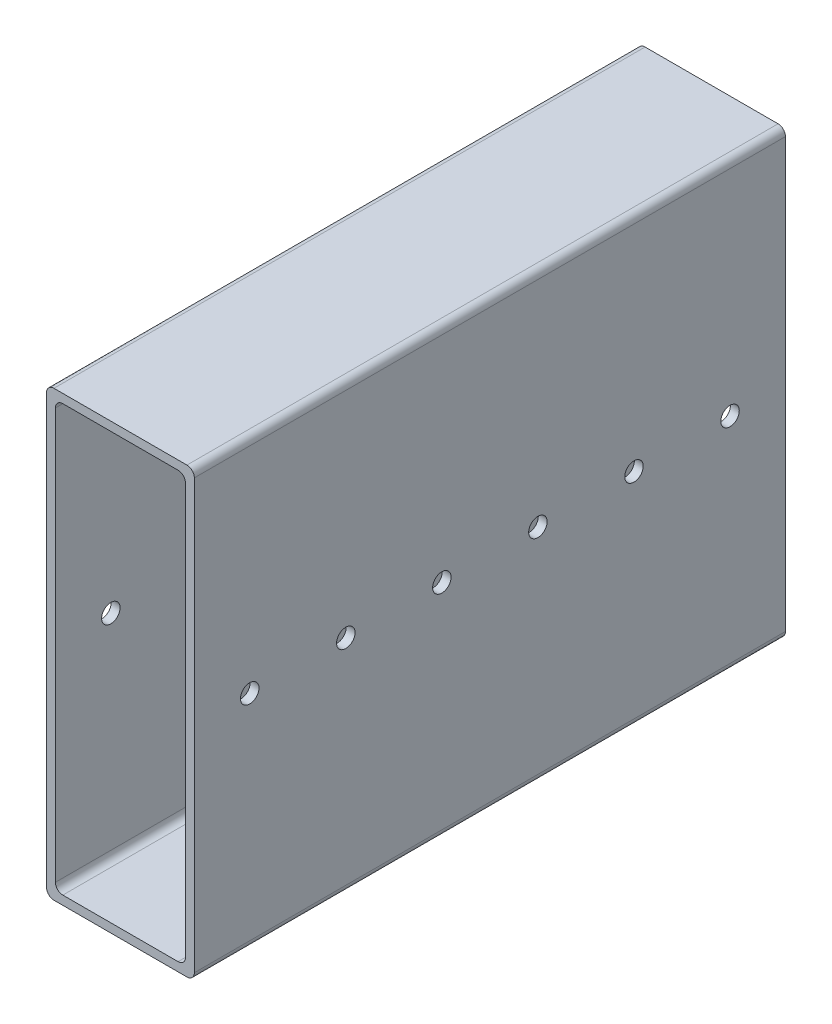
ISO-10303-21;
HEADER;
FILE_DESCRIPTION(('STEP AP214'),'2;1');
FILE_NAME('part.step','',(''),(''),'','','');
FILE_SCHEMA(('AUTOMOTIVE_DESIGN { 1 0 10303 214 1 1 1 1 }'));
ENDSEC;
DATA;
#1=APPLICATION_CONTEXT('core data for automotive mechanical design processes');
#2=APPLICATION_PROTOCOL_DEFINITION('international standard','automotive_design',2000,#1);
#3=PRODUCT_CONTEXT('',#1,'mechanical');
#4=PRODUCT('Part','Part','',(#3));
#5=PRODUCT_RELATED_PRODUCT_CATEGORY('part','',(#4));
#6=PRODUCT_DEFINITION_FORMATION('','',#4);
#7=PRODUCT_DEFINITION_CONTEXT('part definition',#1,'design');
#8=PRODUCT_DEFINITION('design','',#6,#7);
#9=PRODUCT_DEFINITION_SHAPE('','',#8);
#10=(LENGTH_UNIT() NAMED_UNIT(*) SI_UNIT(.MILLI.,.METRE.));
#11=(NAMED_UNIT(*) PLANE_ANGLE_UNIT() SI_UNIT($,.RADIAN.));
#12=(NAMED_UNIT(*) SI_UNIT($,.STERADIAN.) SOLID_ANGLE_UNIT());
#13=UNCERTAINTY_MEASURE_WITH_UNIT(LENGTH_MEASURE(1.E-05),#10,'distance_accuracy_value','');
#14=(GEOMETRIC_REPRESENTATION_CONTEXT(3) GLOBAL_UNCERTAINTY_ASSIGNED_CONTEXT((#13)) GLOBAL_UNIT_ASSIGNED_CONTEXT((#10,
#11,#12)) REPRESENTATION_CONTEXT('',''));
#15=CARTESIAN_POINT('',(0.,0.,0.));
#16=DIRECTION('',(0.,0.,1.));
#17=DIRECTION('',(1.,0.,0.));
#18=AXIS2_PLACEMENT_3D('',#15,#16,#17);
#19=CARTESIAN_POINT('',(34.4194414247179,-15.0508717369566,203.2));
#20=DIRECTION('',(0.,0.,-1.));
#21=DIRECTION('',(-1.,0.,0.));
#22=AXIS2_PLACEMENT_3D('',#19,#20,#21);
#23=CYLINDRICAL_SURFACE('',#22,2.54);
#24=CARTESIAN_POINT('',(34.4194414247179,-15.0508717369566,0.));
#25=DIRECTION('',(0.,0.,1.));
#26=DIRECTION('',(1.,0.,0.));
#27=AXIS2_PLACEMENT_3D('',#24,#25,#26);
#28=CIRCLE('',#27,2.54);
#29=CARTESIAN_POINT('',(34.4194414247179,-17.5908717369566,0.));
#30=VERTEX_POINT('',#29);
#31=CARTESIAN_POINT('',(36.9594414247179,-15.0508717369566,0.));
#32=VERTEX_POINT('',#31);
#33=EDGE_CURVE('E170',#30,#32,#28,.T.);
#34=ORIENTED_EDGE('',*,*,#33,.T.);
#35=DIRECTION('',(0.,0.,-1.));
#36=VECTOR('',#35,1.);
#37=CARTESIAN_POINT('',(36.9594414247179,-15.0508717369566,203.2));
#38=LINE('',#37,#36);
#39=CARTESIAN_POINT('',(36.9594414247179,-15.0508717369566,203.2));
#40=VERTEX_POINT('',#39);
#41=EDGE_CURVE('E151',#40,#32,#38,.T.);
#42=ORIENTED_EDGE('',*,*,#41,.F.);
#43=CARTESIAN_POINT('',(34.4194414247179,-15.0508717369566,203.2));
#44=DIRECTION('',(0.,0.,1.));
#45=DIRECTION('',(1.,0.,0.));
#46=AXIS2_PLACEMENT_3D('',#43,#44,#45);
#47=CIRCLE('',#46,2.54);
#48=CARTESIAN_POINT('',(34.4194414247179,-17.5908717369566,203.2));
#49=VERTEX_POINT('',#48);
#50=EDGE_CURVE('E158',#49,#40,#47,.T.);
#51=ORIENTED_EDGE('',*,*,#50,.F.);
#52=DIRECTION('',(0.,0.,-1.));
#53=VECTOR('',#52,1.);
#54=CARTESIAN_POINT('',(34.4194414247179,-17.5908717369566,203.2));
#55=LINE('',#54,#53);
#56=EDGE_CURVE('E309',#49,#30,#55,.T.);
#57=ORIENTED_EDGE('',*,*,#56,.T.);
#58=EDGE_LOOP('',(#34,#42,#51,#57));
#59=FACE_BOUND('',#58,.T.);
#60=ADVANCED_FACE('F32',(#59),#23,.T.);
#61=CARTESIAN_POINT('',(36.9594414247179,132.269128263043,203.2));
#62=DIRECTION('',(-1.,0.,0.));
#63=DIRECTION('',(0.,-1.,0.));
#64=AXIS2_PLACEMENT_3D('',#61,#62,#63);
#65=PLANE('',#64);
#66=CARTESIAN_POINT('',(36.9594414247179,58.6091282630434,184.15));
#67=DIRECTION('',(1.,0.,0.));
#68=DIRECTION('',(0.,1.,0.));
#69=AXIS2_PLACEMENT_3D('',#66,#67,#68);
#70=CIRCLE('',#69,3.175);
#71=CARTESIAN_POINT('',(36.9594414247179,61.7841282630434,184.15));
#72=VERTEX_POINT('',#71);
#73=EDGE_CURVE('E672',#72,#72,#70,.T.);
#74=ORIENTED_EDGE('',*,*,#73,.F.);
#75=EDGE_LOOP('',(#74));
#76=FACE_BOUND('',#75,.T.);
#77=CARTESIAN_POINT('',(36.9594414247179,58.6091282630434,19.05));
#78=DIRECTION('',(1.,0.,0.));
#79=DIRECTION('',(0.,1.,0.));
#80=AXIS2_PLACEMENT_3D('',#77,#78,#79);
#81=CIRCLE('',#80,3.175);
#82=CARTESIAN_POINT('',(36.9594414247179,61.7841282630434,19.05));
#83=VERTEX_POINT('',#82);
#84=EDGE_CURVE('E230',#83,#83,#81,.T.);
#85=ORIENTED_EDGE('',*,*,#84,.F.);
#86=EDGE_LOOP('',(#85));
#87=FACE_BOUND('',#86,.T.);
#88=CARTESIAN_POINT('',(36.9594414247179,58.6091282630434,151.13));
#89=DIRECTION('',(1.,0.,0.));
#90=DIRECTION('',(0.,1.,0.));
#91=AXIS2_PLACEMENT_3D('',#88,#89,#90);
#92=CIRCLE('',#91,3.175);
#93=CARTESIAN_POINT('',(36.9594414247179,61.7841282630434,151.13));
#94=VERTEX_POINT('',#93);
#95=EDGE_CURVE('E226',#94,#94,#92,.T.);
#96=ORIENTED_EDGE('',*,*,#95,.F.);
#97=EDGE_LOOP('',(#96));
#98=FACE_BOUND('',#97,.T.);
#99=CARTESIAN_POINT('',(36.9594414247179,58.6091282630434,118.11));
#100=DIRECTION('',(1.,0.,0.));
#101=DIRECTION('',(0.,1.,0.));
#102=AXIS2_PLACEMENT_3D('',#99,#100,#101);
#103=CIRCLE('',#102,3.175);
#104=CARTESIAN_POINT('',(36.9594414247179,61.7841282630434,118.11));
#105=VERTEX_POINT('',#104);
#106=EDGE_CURVE('E222',#105,#105,#103,.T.);
#107=ORIENTED_EDGE('',*,*,#106,.F.);
#108=EDGE_LOOP('',(#107));
#109=FACE_BOUND('',#108,.T.);
#110=CARTESIAN_POINT('',(36.9594414247179,58.6091282630434,85.09));
#111=DIRECTION('',(1.,0.,0.));
#112=DIRECTION('',(0.,1.,0.));
#113=AXIS2_PLACEMENT_3D('',#110,#111,#112);
#114=CIRCLE('',#113,3.175);
#115=CARTESIAN_POINT('',(36.9594414247179,61.7841282630434,85.09));
#116=VERTEX_POINT('',#115);
#117=EDGE_CURVE('E217',#116,#116,#114,.T.);
#118=ORIENTED_EDGE('',*,*,#117,.F.);
#119=EDGE_LOOP('',(#118));
#120=FACE_BOUND('',#119,.T.);
#121=CARTESIAN_POINT('',(36.9594414247179,58.6091282630434,52.07));
#122=DIRECTION('',(1.,0.,0.));
#123=DIRECTION('',(0.,1.,0.));
#124=AXIS2_PLACEMENT_3D('',#121,#122,#123);
#125=CIRCLE('',#124,3.17500000000001);
#126=CARTESIAN_POINT('',(36.9594414247179,61.7841282630434,52.07));
#127=VERTEX_POINT('',#126);
#128=EDGE_CURVE('E212',#127,#127,#125,.T.);
#129=ORIENTED_EDGE('',*,*,#128,.F.);
#130=EDGE_LOOP('',(#129));
#131=FACE_BOUND('',#130,.T.);
#132=DIRECTION('',(0.,1.,0.));
#133=VECTOR('',#132,1.);
#134=CARTESIAN_POINT('',(36.9594414247179,132.269128263043,0.));
#135=LINE('',#134,#133);
#136=CARTESIAN_POINT('',(36.9594414247179,132.269128263043,0.));
#137=VERTEX_POINT('',#136);
#138=EDGE_CURVE('E311',#32,#137,#135,.T.);
#139=ORIENTED_EDGE('',*,*,#138,.T.);
#140=DIRECTION('',(0.,0.,-1.));
#141=VECTOR('',#140,1.);
#142=CARTESIAN_POINT('',(36.9594414247179,132.269128263043,203.2));
#143=LINE('',#142,#141);
#144=CARTESIAN_POINT('',(36.9594414247179,132.269128263043,203.2));
#145=VERTEX_POINT('',#144);
#146=EDGE_CURVE('E154',#145,#137,#143,.T.);
#147=ORIENTED_EDGE('',*,*,#146,.F.);
#148=DIRECTION('',(0.,1.,0.));
#149=VECTOR('',#148,1.);
#150=CARTESIAN_POINT('',(36.9594414247179,132.269128263043,203.2));
#151=LINE('',#150,#149);
#152=EDGE_CURVE('E147',#40,#145,#151,.T.);
#153=ORIENTED_EDGE('',*,*,#152,.F.);
#154=ORIENTED_EDGE('',*,*,#41,.T.);
#155=EDGE_LOOP('',(#139,#147,#153,#154));
#156=FACE_BOUND('',#155,.T.);
#157=ADVANCED_FACE('F149',(#76,#87,#98,#109,#120,#131,#156),#65,.F.);
#158=CARTESIAN_POINT('',(34.4194414247179,132.269128263043,203.2));
#159=DIRECTION('',(0.,0.,-1.));
#160=DIRECTION('',(-1.,0.,0.));
#161=AXIS2_PLACEMENT_3D('',#158,#159,#160);
#162=CYLINDRICAL_SURFACE('',#161,2.53999999999999);
#163=CARTESIAN_POINT('',(34.4194414247179,132.269128263043,0.));
#164=DIRECTION('',(0.,0.,1.));
#165=DIRECTION('',(1.,0.,0.));
#166=AXIS2_PLACEMENT_3D('',#163,#164,#165);
#167=CIRCLE('',#166,2.53999999999999);
#168=CARTESIAN_POINT('',(34.4194414247179,134.809128263043,0.));
#169=VERTEX_POINT('',#168);
#170=EDGE_CURVE('E313',#137,#169,#167,.T.);
#171=ORIENTED_EDGE('',*,*,#170,.T.);
#172=DIRECTION('',(0.,0.,-1.));
#173=VECTOR('',#172,1.);
#174=CARTESIAN_POINT('',(34.4194414247179,134.809128263043,203.2));
#175=LINE('',#174,#173);
#176=CARTESIAN_POINT('',(34.4194414247179,134.809128263043,203.2));
#177=VERTEX_POINT('',#176);
#178=EDGE_CURVE('E175',#177,#169,#175,.T.);
#179=ORIENTED_EDGE('',*,*,#178,.F.);
#180=CARTESIAN_POINT('',(34.4194414247179,132.269128263043,203.2));
#181=DIRECTION('',(0.,0.,1.));
#182=DIRECTION('',(1.,0.,0.));
#183=AXIS2_PLACEMENT_3D('',#180,#181,#182);
#184=CIRCLE('',#183,2.53999999999999);
#185=EDGE_CURVE('E157',#145,#177,#184,.T.);
#186=ORIENTED_EDGE('',*,*,#185,.F.);
#187=ORIENTED_EDGE('',*,*,#146,.T.);
#188=EDGE_LOOP('',(#171,#179,#186,#187));
#189=FACE_BOUND('',#188,.T.);
#190=ADVANCED_FACE('F360',(#189),#162,.T.);
#191=CARTESIAN_POINT('',(-11.3005585752821,134.809128263043,203.2));
#192=DIRECTION('',(0.,-1.,0.));
#193=DIRECTION('',(0.,0.,-1.));
#194=AXIS2_PLACEMENT_3D('',#191,#192,#193);
#195=PLANE('',#194);
#196=DIRECTION('',(-1.,0.,0.));
#197=VECTOR('',#196,1.);
#198=CARTESIAN_POINT('',(-11.3005585752821,134.809128263043,0.));
#199=LINE('',#198,#197);
#200=CARTESIAN_POINT('',(-11.3005585752821,134.809128263043,0.));
#201=VERTEX_POINT('',#200);
#202=EDGE_CURVE('E315',#169,#201,#199,.T.);
#203=ORIENTED_EDGE('',*,*,#202,.T.);
#204=DIRECTION('',(0.,0.,-1.));
#205=VECTOR('',#204,1.);
#206=CARTESIAN_POINT('',(-11.3005585752821,134.809128263043,203.2));
#207=LINE('',#206,#205);
#208=CARTESIAN_POINT('',(-11.3005585752821,134.809128263043,203.2));
#209=VERTEX_POINT('',#208);
#210=EDGE_CURVE('E334',#209,#201,#207,.T.);
#211=ORIENTED_EDGE('',*,*,#210,.F.);
#212=DIRECTION('',(-1.,0.,0.));
#213=VECTOR('',#212,1.);
#214=CARTESIAN_POINT('',(-11.3005585752821,134.809128263043,203.2));
#215=LINE('',#214,#213);
#216=EDGE_CURVE('E300',#177,#209,#215,.T.);
#217=ORIENTED_EDGE('',*,*,#216,.F.);
#218=ORIENTED_EDGE('',*,*,#178,.T.);
#219=EDGE_LOOP('',(#203,#211,#217,#218));
#220=FACE_BOUND('',#219,.T.);
#221=ADVANCED_FACE('F341',(#220),#195,.F.);
#222=CARTESIAN_POINT('',(-11.3005585752821,132.269128263043,203.2));
#223=DIRECTION('',(0.,0.,-1.));
#224=DIRECTION('',(-1.,0.,0.));
#225=AXIS2_PLACEMENT_3D('',#222,#223,#224);
#226=CYLINDRICAL_SURFACE('',#225,2.53999999999999);
#227=CARTESIAN_POINT('',(-11.3005585752821,132.269128263043,0.));
#228=DIRECTION('',(0.,0.,1.));
#229=DIRECTION('',(-1.,0.,0.));
#230=AXIS2_PLACEMENT_3D('',#227,#228,#229);
#231=CIRCLE('',#230,2.53999999999999);
#232=CARTESIAN_POINT('',(-13.8405585752821,132.269128263043,0.));
#233=VERTEX_POINT('',#232);
#234=EDGE_CURVE('E317',#201,#233,#231,.T.);
#235=ORIENTED_EDGE('',*,*,#234,.T.);
#236=DIRECTION('',(0.,0.,-1.));
#237=VECTOR('',#236,1.);
#238=CARTESIAN_POINT('',(-13.8405585752821,132.269128263043,203.2));
#239=LINE('',#238,#237);
#240=CARTESIAN_POINT('',(-13.8405585752821,132.269128263043,203.2));
#241=VERTEX_POINT('',#240);
#242=EDGE_CURVE('E331',#241,#233,#239,.T.);
#243=ORIENTED_EDGE('',*,*,#242,.F.);
#244=CARTESIAN_POINT('',(-11.3005585752821,132.269128263043,203.2));
#245=DIRECTION('',(0.,0.,1.));
#246=DIRECTION('',(-1.,0.,0.));
#247=AXIS2_PLACEMENT_3D('',#244,#245,#246);
#248=CIRCLE('',#247,2.53999999999999);
#249=EDGE_CURVE('E302',#209,#241,#248,.T.);
#250=ORIENTED_EDGE('',*,*,#249,.F.);
#251=ORIENTED_EDGE('',*,*,#210,.T.);
#252=EDGE_LOOP('',(#235,#243,#250,#251));
#253=FACE_BOUND('',#252,.T.);
#254=ADVANCED_FACE('F352',(#253),#226,.T.);
#255=CARTESIAN_POINT('',(-13.8405585752821,132.269128263043,203.2));
#256=DIRECTION('',(1.,0.,0.));
#257=DIRECTION('',(0.,1.,0.));
#258=AXIS2_PLACEMENT_3D('',#255,#256,#257);
#259=PLANE('',#258);
#260=CARTESIAN_POINT('',(-13.8405585752821,58.6091282630434,184.15));
#261=DIRECTION('',(1.,0.,0.));
#262=DIRECTION('',(0.,1.,0.));
#263=AXIS2_PLACEMENT_3D('',#260,#261,#262);
#264=CIRCLE('',#263,3.175);
#265=CARTESIAN_POINT('',(-13.8405585752821,61.7841282630434,184.15));
#266=VERTEX_POINT('',#265);
#267=EDGE_CURVE('E237',#266,#266,#264,.T.);
#268=ORIENTED_EDGE('',*,*,#267,.T.);
#269=EDGE_LOOP('',(#268));
#270=FACE_BOUND('',#269,.T.);
#271=CARTESIAN_POINT('',(-13.8405585752821,58.6091282630434,19.05));
#272=DIRECTION('',(1.,0.,0.));
#273=DIRECTION('',(0.,1.,0.));
#274=AXIS2_PLACEMENT_3D('',#271,#272,#273);
#275=CIRCLE('',#274,3.175);
#276=CARTESIAN_POINT('',(-13.8405585752821,61.7841282630434,19.05));
#277=VERTEX_POINT('',#276);
#278=EDGE_CURVE('E234',#277,#277,#275,.T.);
#279=ORIENTED_EDGE('',*,*,#278,.T.);
#280=EDGE_LOOP('',(#279));
#281=FACE_BOUND('',#280,.T.);
#282=CARTESIAN_POINT('',(-13.8405585752821,58.6091282630434,151.13));
#283=DIRECTION('',(1.,0.,0.));
#284=DIRECTION('',(0.,1.,0.));
#285=AXIS2_PLACEMENT_3D('',#282,#283,#284);
#286=CIRCLE('',#285,3.175);
#287=CARTESIAN_POINT('',(-13.8405585752821,61.7841282630434,151.13));
#288=VERTEX_POINT('',#287);
#289=EDGE_CURVE('E252',#288,#288,#286,.T.);
#290=ORIENTED_EDGE('',*,*,#289,.T.);
#291=EDGE_LOOP('',(#290));
#292=FACE_BOUND('',#291,.T.);
#293=CARTESIAN_POINT('',(-13.8405585752821,58.6091282630434,118.11));
#294=DIRECTION('',(1.,0.,0.));
#295=DIRECTION('',(0.,1.,0.));
#296=AXIS2_PLACEMENT_3D('',#293,#294,#295);
#297=CIRCLE('',#296,3.175);
#298=CARTESIAN_POINT('',(-13.8405585752821,61.7841282630434,118.11));
#299=VERTEX_POINT('',#298);
#300=EDGE_CURVE('E259',#299,#299,#297,.T.);
#301=ORIENTED_EDGE('',*,*,#300,.T.);
#302=EDGE_LOOP('',(#301));
#303=FACE_BOUND('',#302,.T.);
#304=CARTESIAN_POINT('',(-13.8405585752821,58.6091282630434,85.09));
#305=DIRECTION('',(1.,0.,0.));
#306=DIRECTION('',(0.,1.,0.));
#307=AXIS2_PLACEMENT_3D('',#304,#305,#306);
#308=CIRCLE('',#307,3.175);
#309=CARTESIAN_POINT('',(-13.8405585752821,61.7841282630434,85.09));
#310=VERTEX_POINT('',#309);
#311=EDGE_CURVE('E266',#310,#310,#308,.T.);
#312=ORIENTED_EDGE('',*,*,#311,.T.);
#313=EDGE_LOOP('',(#312));
#314=FACE_BOUND('',#313,.T.);
#315=CARTESIAN_POINT('',(-13.8405585752821,58.6091282630434,52.07));
#316=DIRECTION('',(1.,0.,0.));
#317=DIRECTION('',(0.,1.,0.));
#318=AXIS2_PLACEMENT_3D('',#315,#316,#317);
#319=CIRCLE('',#318,3.17500000000001);
#320=CARTESIAN_POINT('',(-13.8405585752821,61.7841282630434,52.07));
#321=VERTEX_POINT('',#320);
#322=EDGE_CURVE('E273',#321,#321,#319,.T.);
#323=ORIENTED_EDGE('',*,*,#322,.T.);
#324=EDGE_LOOP('',(#323));
#325=FACE_BOUND('',#324,.T.);
#326=DIRECTION('',(0.,-1.,0.));
#327=VECTOR('',#326,1.);
#328=CARTESIAN_POINT('',(-13.8405585752821,132.269128263043,0.));
#329=LINE('',#328,#327);
#330=CARTESIAN_POINT('',(-13.8405585752821,-15.0508717369566,0.));
#331=VERTEX_POINT('',#330);
#332=EDGE_CURVE('E319',#233,#331,#329,.T.);
#333=ORIENTED_EDGE('',*,*,#332,.T.);
#334=DIRECTION('',(0.,0.,-1.));
#335=VECTOR('',#334,1.);
#336=CARTESIAN_POINT('',(-13.8405585752821,-15.0508717369566,203.2));
#337=LINE('',#336,#335);
#338=CARTESIAN_POINT('',(-13.8405585752821,-15.0508717369566,203.2));
#339=VERTEX_POINT('',#338);
#340=EDGE_CURVE('E328',#339,#331,#337,.T.);
#341=ORIENTED_EDGE('',*,*,#340,.F.);
#342=DIRECTION('',(0.,-1.,0.));
#343=VECTOR('',#342,1.);
#344=CARTESIAN_POINT('',(-13.8405585752821,132.269128263043,203.2));
#345=LINE('',#344,#343);
#346=EDGE_CURVE('E304',#241,#339,#345,.T.);
#347=ORIENTED_EDGE('',*,*,#346,.F.);
#348=ORIENTED_EDGE('',*,*,#242,.T.);
#349=EDGE_LOOP('',(#333,#341,#347,#348));
#350=FACE_BOUND('',#349,.T.);
#351=ADVANCED_FACE('F356',(#270,#281,#292,#303,#314,#325,#350),#259,.F.);
#352=CARTESIAN_POINT('',(-11.3005585752821,-15.0508717369566,203.2));
#353=DIRECTION('',(0.,0.,-1.));
#354=DIRECTION('',(-1.,0.,0.));
#355=AXIS2_PLACEMENT_3D('',#352,#353,#354);
#356=CYLINDRICAL_SURFACE('',#355,2.54);
#357=CARTESIAN_POINT('',(-11.3005585752821,-15.0508717369566,0.));
#358=DIRECTION('',(0.,0.,1.));
#359=DIRECTION('',(-1.,0.,0.));
#360=AXIS2_PLACEMENT_3D('',#357,#358,#359);
#361=CIRCLE('',#360,2.54);
#362=CARTESIAN_POINT('',(-11.3005585752821,-17.5908717369566,0.));
#363=VERTEX_POINT('',#362);
#364=EDGE_CURVE('E321',#331,#363,#361,.T.);
#365=ORIENTED_EDGE('',*,*,#364,.T.);
#366=DIRECTION('',(0.,0.,-1.));
#367=VECTOR('',#366,1.);
#368=CARTESIAN_POINT('',(-11.3005585752821,-17.5908717369566,203.2));
#369=LINE('',#368,#367);
#370=CARTESIAN_POINT('',(-11.3005585752821,-17.5908717369566,203.2));
#371=VERTEX_POINT('',#370);
#372=EDGE_CURVE('E325',#371,#363,#369,.T.);
#373=ORIENTED_EDGE('',*,*,#372,.F.);
#374=CARTESIAN_POINT('',(-11.3005585752821,-15.0508717369566,203.2));
#375=DIRECTION('',(0.,0.,1.));
#376=DIRECTION('',(-1.,0.,0.));
#377=AXIS2_PLACEMENT_3D('',#374,#375,#376);
#378=CIRCLE('',#377,2.54);
#379=EDGE_CURVE('E306',#339,#371,#378,.T.);
#380=ORIENTED_EDGE('',*,*,#379,.F.);
#381=ORIENTED_EDGE('',*,*,#340,.T.);
#382=EDGE_LOOP('',(#365,#373,#380,#381));
#383=FACE_BOUND('',#382,.T.);
#384=ADVANCED_FACE('F427',(#383),#356,.T.);
#385=CARTESIAN_POINT('',(-11.3005585752821,-17.5908717369566,203.2));
#386=DIRECTION('',(0.,1.,0.));
#387=DIRECTION('',(0.,0.,1.));
#388=AXIS2_PLACEMENT_3D('',#385,#386,#387);
#389=PLANE('',#388);
#390=DIRECTION('',(1.,0.,0.));
#391=VECTOR('',#390,1.);
#392=CARTESIAN_POINT('',(-11.3005585752821,-17.5908717369566,0.));
#393=LINE('',#392,#391);
#394=EDGE_CURVE('E167',#363,#30,#393,.T.);
#395=ORIENTED_EDGE('',*,*,#394,.T.);
#396=ORIENTED_EDGE('',*,*,#56,.F.);
#397=DIRECTION('',(1.,0.,0.));
#398=VECTOR('',#397,1.);
#399=CARTESIAN_POINT('',(-11.3005585752821,-17.5908717369566,203.2));
#400=LINE('',#399,#398);
#401=EDGE_CURVE('E163',#371,#49,#400,.T.);
#402=ORIENTED_EDGE('',*,*,#401,.F.);
#403=ORIENTED_EDGE('',*,*,#372,.T.);
#404=EDGE_LOOP('',(#395,#396,#402,#403));
#405=FACE_BOUND('',#404,.T.);
#406=ADVANCED_FACE('F421',(#405),#389,.F.);
#407=CARTESIAN_POINT('',(34.4194414247179,-15.0508717369566,203.2));
#408=DIRECTION('',(0.,0.,1.));
#409=DIRECTION('',(1.,0.,0.));
#410=AXIS2_PLACEMENT_3D('',#407,#408,#409);
#411=PLANE('',#410);
#412=DIRECTION('',(1.,0.,0.));
#413=VECTOR('',#412,1.);
#414=CARTESIAN_POINT('',(-11.3005585752821,-14.5428717369566,203.2));
#415=LINE('',#414,#413);
#416=CARTESIAN_POINT('',(-8.2525585752821,-14.5428717369566,203.2));
#417=VERTEX_POINT('',#416);
#418=CARTESIAN_POINT('',(31.3714414247179,-14.5428717369566,203.2));
#419=VERTEX_POINT('',#418);
#420=EDGE_CURVE('E296',#417,#419,#415,.T.);
#421=ORIENTED_EDGE('',*,*,#420,.F.);
#422=CARTESIAN_POINT('',(-8.2525585752821,-12.0028717369566,203.2));
#423=DIRECTION('',(0.,0.,1.));
#424=DIRECTION('',(1.,0.,0.));
#425=AXIS2_PLACEMENT_3D('',#422,#423,#424);
#426=CIRCLE('',#425,2.54);
#427=CARTESIAN_POINT('',(-10.7925585752821,-12.0028717369566,203.2));
#428=VERTEX_POINT('',#427);
#429=EDGE_CURVE('E201',#417,#428,#426,.F.);
#430=ORIENTED_EDGE('',*,*,#429,.T.);
#431=DIRECTION('',(0.,-1.,0.));
#432=VECTOR('',#431,1.);
#433=CARTESIAN_POINT('',(-10.7925585752821,132.269128263043,203.2));
#434=LINE('',#433,#432);
#435=CARTESIAN_POINT('',(-10.7925585752821,129.221128263043,203.2));
#436=VERTEX_POINT('',#435);
#437=EDGE_CURVE('E293',#436,#428,#434,.T.);
#438=ORIENTED_EDGE('',*,*,#437,.F.);
#439=CARTESIAN_POINT('',(-8.25255857528212,129.221128263043,203.2));
#440=DIRECTION('',(0.,0.,1.));
#441=DIRECTION('',(1.,0.,0.));
#442=AXIS2_PLACEMENT_3D('',#439,#440,#441);
#443=CIRCLE('',#442,2.54);
#444=CARTESIAN_POINT('',(-8.25255857528212,131.761128263043,203.2));
#445=VERTEX_POINT('',#444);
#446=EDGE_CURVE('E11',#436,#445,#443,.F.);
#447=ORIENTED_EDGE('',*,*,#446,.T.);
#448=DIRECTION('',(-1.,0.,0.));
#449=VECTOR('',#448,1.);
#450=CARTESIAN_POINT('',(-11.3005585752821,131.761128263043,203.2));
#451=LINE('',#450,#449);
#452=CARTESIAN_POINT('',(31.3714414247179,131.761128263043,203.2));
#453=VERTEX_POINT('',#452);
#454=EDGE_CURVE('E291',#453,#445,#451,.T.);
#455=ORIENTED_EDGE('',*,*,#454,.F.);
#456=CARTESIAN_POINT('',(31.3714414247179,129.221128263043,203.2));
#457=DIRECTION('',(0.,0.,1.));
#458=DIRECTION('',(1.,0.,0.));
#459=AXIS2_PLACEMENT_3D('',#456,#457,#458);
#460=CIRCLE('',#459,2.54);
#461=CARTESIAN_POINT('',(33.9114414247179,129.221128263043,203.2));
#462=VERTEX_POINT('',#461);
#463=EDGE_CURVE('E205',#453,#462,#460,.F.);
#464=ORIENTED_EDGE('',*,*,#463,.T.);
#465=DIRECTION('',(0.,1.,0.));
#466=VECTOR('',#465,1.);
#467=CARTESIAN_POINT('',(33.9114414247179,132.269128263043,203.2));
#468=LINE('',#467,#466);
#469=CARTESIAN_POINT('',(33.9114414247179,-12.0028717369566,203.2));
#470=VERTEX_POINT('',#469);
#471=EDGE_CURVE('E283',#470,#462,#468,.T.);
#472=ORIENTED_EDGE('',*,*,#471,.F.);
#473=CARTESIAN_POINT('',(31.3714414247179,-12.0028717369566,203.2));
#474=DIRECTION('',(0.,0.,1.));
#475=DIRECTION('',(1.,0.,0.));
#476=AXIS2_PLACEMENT_3D('',#473,#474,#475);
#477=CIRCLE('',#476,2.54);
#478=EDGE_CURVE('E197',#470,#419,#477,.F.);
#479=ORIENTED_EDGE('',*,*,#478,.T.);
#480=EDGE_LOOP('',(#421,#430,#438,#447,#455,#464,#472,#479));
#481=FACE_BOUND('',#480,.T.);
#482=ORIENTED_EDGE('',*,*,#50,.T.);
#483=ORIENTED_EDGE('',*,*,#152,.T.);
#484=ORIENTED_EDGE('',*,*,#185,.T.);
#485=ORIENTED_EDGE('',*,*,#216,.T.);
#486=ORIENTED_EDGE('',*,*,#249,.T.);
#487=ORIENTED_EDGE('',*,*,#346,.T.);
#488=ORIENTED_EDGE('',*,*,#379,.T.);
#489=ORIENTED_EDGE('',*,*,#401,.T.);
#490=EDGE_LOOP('',(#482,#483,#484,#485,#486,#487,#488,#489));
#491=FACE_BOUND('',#490,.T.);
#492=ADVANCED_FACE('F161',(#481,#491),#411,.T.);
#493=CARTESIAN_POINT('',(34.4194414247179,-15.0508717369566,0.));
#494=DIRECTION('',(0.,0.,1.));
#495=DIRECTION('',(1.,0.,0.));
#496=AXIS2_PLACEMENT_3D('',#493,#494,#495);
#497=PLANE('',#496);
#498=DIRECTION('',(0.,-1.,0.));
#499=VECTOR('',#498,1.);
#500=CARTESIAN_POINT('',(-10.7925585752821,132.269128263043,0.));
#501=LINE('',#500,#499);
#502=CARTESIAN_POINT('',(-10.7925585752821,129.221128263043,0.));
#503=VERTEX_POINT('',#502);
#504=CARTESIAN_POINT('',(-10.7925585752821,-12.0028717369566,0.));
#505=VERTEX_POINT('',#504);
#506=EDGE_CURVE('E284',#503,#505,#501,.T.);
#507=ORIENTED_EDGE('',*,*,#506,.T.);
#508=CARTESIAN_POINT('',(-8.2525585752821,-12.0028717369566,0.));
#509=DIRECTION('',(0.,0.,1.));
#510=DIRECTION('',(1.,0.,0.));
#511=AXIS2_PLACEMENT_3D('',#508,#509,#510);
#512=CIRCLE('',#511,2.54);
#513=CARTESIAN_POINT('',(-8.2525585752821,-14.5428717369566,0.));
#514=VERTEX_POINT('',#513);
#515=EDGE_CURVE('E199',#505,#514,#512,.T.);
#516=ORIENTED_EDGE('',*,*,#515,.T.);
#517=DIRECTION('',(1.,0.,0.));
#518=VECTOR('',#517,1.);
#519=CARTESIAN_POINT('',(-11.3005585752821,-14.5428717369566,0.));
#520=LINE('',#519,#518);
#521=CARTESIAN_POINT('',(31.3714414247179,-14.5428717369566,0.));
#522=VERTEX_POINT('',#521);
#523=EDGE_CURVE('E280',#514,#522,#520,.T.);
#524=ORIENTED_EDGE('',*,*,#523,.T.);
#525=CARTESIAN_POINT('',(31.3714414247179,-12.0028717369566,0.));
#526=DIRECTION('',(0.,0.,1.));
#527=DIRECTION('',(1.,0.,0.));
#528=AXIS2_PLACEMENT_3D('',#525,#526,#527);
#529=CIRCLE('',#528,2.54);
#530=CARTESIAN_POINT('',(33.9114414247179,-12.0028717369566,0.));
#531=VERTEX_POINT('',#530);
#532=EDGE_CURVE('E195',#522,#531,#529,.T.);
#533=ORIENTED_EDGE('',*,*,#532,.T.);
#534=DIRECTION('',(0.,1.,0.));
#535=VECTOR('',#534,1.);
#536=CARTESIAN_POINT('',(33.9114414247179,132.269128263043,0.));
#537=LINE('',#536,#535);
#538=CARTESIAN_POINT('',(33.9114414247179,129.221128263043,0.));
#539=VERTEX_POINT('',#538);
#540=EDGE_CURVE('E276',#531,#539,#537,.T.);
#541=ORIENTED_EDGE('',*,*,#540,.T.);
#542=CARTESIAN_POINT('',(31.3714414247179,129.221128263043,0.));
#543=DIRECTION('',(0.,0.,1.));
#544=DIRECTION('',(1.,0.,0.));
#545=AXIS2_PLACEMENT_3D('',#542,#543,#544);
#546=CIRCLE('',#545,2.54);
#547=CARTESIAN_POINT('',(31.3714414247179,131.761128263043,0.));
#548=VERTEX_POINT('',#547);
#549=EDGE_CURVE('E203',#539,#548,#546,.T.);
#550=ORIENTED_EDGE('',*,*,#549,.T.);
#551=DIRECTION('',(-1.,0.,0.));
#552=VECTOR('',#551,1.);
#553=CARTESIAN_POINT('',(-11.3005585752821,131.761128263043,0.));
#554=LINE('',#553,#552);
#555=CARTESIAN_POINT('',(-8.25255857528212,131.761128263043,0.));
#556=VERTEX_POINT('',#555);
#557=EDGE_CURVE('E279',#548,#556,#554,.T.);
#558=ORIENTED_EDGE('',*,*,#557,.T.);
#559=CARTESIAN_POINT('',(-8.25255857528212,129.221128263043,0.));
#560=DIRECTION('',(0.,0.,1.));
#561=DIRECTION('',(1.,0.,0.));
#562=AXIS2_PLACEMENT_3D('',#559,#560,#561);
#563=CIRCLE('',#562,2.54);
#564=EDGE_CURVE('E41',#556,#503,#563,.T.);
#565=ORIENTED_EDGE('',*,*,#564,.T.);
#566=EDGE_LOOP('',(#507,#516,#524,#533,#541,#550,#558,#565));
#567=FACE_BOUND('',#566,.T.);
#568=ORIENTED_EDGE('',*,*,#33,.F.);
#569=ORIENTED_EDGE('',*,*,#394,.F.);
#570=ORIENTED_EDGE('',*,*,#364,.F.);
#571=ORIENTED_EDGE('',*,*,#332,.F.);
#572=ORIENTED_EDGE('',*,*,#234,.F.);
#573=ORIENTED_EDGE('',*,*,#202,.F.);
#574=ORIENTED_EDGE('',*,*,#170,.F.);
#575=ORIENTED_EDGE('',*,*,#138,.F.);
#576=EDGE_LOOP('',(#568,#569,#570,#571,#572,#573,#574,#575));
#577=FACE_BOUND('',#576,.T.);
#578=ADVANCED_FACE('F347',(#567,#577),#497,.F.);
#579=CARTESIAN_POINT('',(33.9114414247179,132.269128263043,203.2));
#580=DIRECTION('',(-1.,0.,0.));
#581=DIRECTION('',(0.,-1.,0.));
#582=AXIS2_PLACEMENT_3D('',#579,#580,#581);
#583=PLANE('',#582);
#584=CARTESIAN_POINT('',(33.9114414247179,58.6091282630434,184.15));
#585=DIRECTION('',(-1.,0.,0.));
#586=DIRECTION('',(0.,-1.,0.));
#587=AXIS2_PLACEMENT_3D('',#584,#585,#586);
#588=CIRCLE('',#587,3.175);
#589=CARTESIAN_POINT('',(33.9114414247179,55.4341282630434,184.15));
#590=VERTEX_POINT('',#589);
#591=EDGE_CURVE('E242',#590,#590,#588,.T.);
#592=ORIENTED_EDGE('',*,*,#591,.F.);
#593=EDGE_LOOP('',(#592));
#594=FACE_BOUND('',#593,.T.);
#595=CARTESIAN_POINT('',(33.9114414247179,58.6091282630434,19.05));
#596=DIRECTION('',(-1.,0.,0.));
#597=DIRECTION('',(0.,-1.,0.));
#598=AXIS2_PLACEMENT_3D('',#595,#596,#597);
#599=CIRCLE('',#598,3.175);
#600=CARTESIAN_POINT('',(33.9114414247179,55.4341282630434,19.05));
#601=VERTEX_POINT('',#600);
#602=EDGE_CURVE('E229',#601,#601,#599,.T.);
#603=ORIENTED_EDGE('',*,*,#602,.F.);
#604=EDGE_LOOP('',(#603));
#605=FACE_BOUND('',#604,.T.);
#606=CARTESIAN_POINT('',(33.9114414247179,58.6091282630434,151.13));
#607=DIRECTION('',(-1.,0.,0.));
#608=DIRECTION('',(0.,-1.,0.));
#609=AXIS2_PLACEMENT_3D('',#606,#607,#608);
#610=CIRCLE('',#609,3.175);
#611=CARTESIAN_POINT('',(33.9114414247179,55.4341282630434,151.13));
#612=VERTEX_POINT('',#611);
#613=EDGE_CURVE('E225',#612,#612,#610,.T.);
#614=ORIENTED_EDGE('',*,*,#613,.F.);
#615=EDGE_LOOP('',(#614));
#616=FACE_BOUND('',#615,.T.);
#617=CARTESIAN_POINT('',(33.9114414247179,58.6091282630434,118.11));
#618=DIRECTION('',(-1.,0.,0.));
#619=DIRECTION('',(0.,-1.,0.));
#620=AXIS2_PLACEMENT_3D('',#617,#618,#619);
#621=CIRCLE('',#620,3.175);
#622=CARTESIAN_POINT('',(33.9114414247179,55.4341282630434,118.11));
#623=VERTEX_POINT('',#622);
#624=EDGE_CURVE('E221',#623,#623,#621,.T.);
#625=ORIENTED_EDGE('',*,*,#624,.F.);
#626=EDGE_LOOP('',(#625));
#627=FACE_BOUND('',#626,.T.);
#628=CARTESIAN_POINT('',(33.9114414247179,58.6091282630434,85.09));
#629=DIRECTION('',(-1.,0.,0.));
#630=DIRECTION('',(0.,-1.,0.));
#631=AXIS2_PLACEMENT_3D('',#628,#629,#630);
#632=CIRCLE('',#631,3.175);
#633=CARTESIAN_POINT('',(33.9114414247179,55.4341282630434,85.09));
#634=VERTEX_POINT('',#633);
#635=EDGE_CURVE('E216',#634,#634,#632,.T.);
#636=ORIENTED_EDGE('',*,*,#635,.F.);
#637=EDGE_LOOP('',(#636));
#638=FACE_BOUND('',#637,.T.);
#639=CARTESIAN_POINT('',(33.9114414247179,58.6091282630434,52.07));
#640=DIRECTION('',(-1.,0.,0.));
#641=DIRECTION('',(0.,-1.,0.));
#642=AXIS2_PLACEMENT_3D('',#639,#640,#641);
#643=CIRCLE('',#642,3.17500000000001);
#644=CARTESIAN_POINT('',(33.9114414247179,55.4341282630434,52.07));
#645=VERTEX_POINT('',#644);
#646=EDGE_CURVE('E211',#645,#645,#643,.T.);
#647=ORIENTED_EDGE('',*,*,#646,.F.);
#648=EDGE_LOOP('',(#647));
#649=FACE_BOUND('',#648,.T.);
#650=ORIENTED_EDGE('',*,*,#540,.F.);
#651=DIRECTION('',(0.,0.,-1.));
#652=VECTOR('',#651,1.);
#653=CARTESIAN_POINT('',(33.9114414247179,-12.0028717369566,203.2));
#654=LINE('',#653,#652);
#655=EDGE_CURVE('E184',#531,#470,#654,.F.);
#656=ORIENTED_EDGE('',*,*,#655,.T.);
#657=ORIENTED_EDGE('',*,*,#471,.T.);
#658=DIRECTION('',(0.,0.,-1.));
#659=VECTOR('',#658,1.);
#660=CARTESIAN_POINT('',(33.9114414247179,129.221128263043,0.));
#661=LINE('',#660,#659);
#662=EDGE_CURVE('E181',#462,#539,#661,.T.);
#663=ORIENTED_EDGE('',*,*,#662,.T.);
#664=EDGE_LOOP('',(#650,#656,#657,#663));
#665=FACE_BOUND('',#664,.T.);
#666=ADVANCED_FACE('F398',(#594,#605,#616,#627,#638,#649,#665),#583,.T.);
#667=CARTESIAN_POINT('',(-11.3005585752821,131.761128263043,203.2));
#668=DIRECTION('',(0.,-1.,0.));
#669=DIRECTION('',(0.,0.,-1.));
#670=AXIS2_PLACEMENT_3D('',#667,#668,#669);
#671=PLANE('',#670);
#672=ORIENTED_EDGE('',*,*,#557,.F.);
#673=DIRECTION('',(0.,0.,-1.));
#674=VECTOR('',#673,1.);
#675=CARTESIAN_POINT('',(31.3714414247179,131.761128263043,203.2));
#676=LINE('',#675,#674);
#677=EDGE_CURVE('E54',#548,#453,#676,.F.);
#678=ORIENTED_EDGE('',*,*,#677,.T.);
#679=ORIENTED_EDGE('',*,*,#454,.T.);
#680=DIRECTION('',(0.,0.,-1.));
#681=VECTOR('',#680,1.);
#682=CARTESIAN_POINT('',(-8.25255857528212,131.761128263043,0.));
#683=LINE('',#682,#681);
#684=EDGE_CURVE('E191',#445,#556,#683,.T.);
#685=ORIENTED_EDGE('',*,*,#684,.T.);
#686=EDGE_LOOP('',(#672,#678,#679,#685));
#687=FACE_BOUND('',#686,.T.);
#688=ADVANCED_FACE('F411',(#687),#671,.T.);
#689=CARTESIAN_POINT('',(-10.7925585752821,132.269128263043,203.2));
#690=DIRECTION('',(1.,0.,0.));
#691=DIRECTION('',(0.,1.,0.));
#692=AXIS2_PLACEMENT_3D('',#689,#690,#691);
#693=PLANE('',#692);
#694=CARTESIAN_POINT('',(-10.7925585752821,58.6091282630434,184.15));
#695=DIRECTION('',(1.,0.,0.));
#696=DIRECTION('',(0.,1.,0.));
#697=AXIS2_PLACEMENT_3D('',#694,#695,#696);
#698=CIRCLE('',#697,3.175);
#699=CARTESIAN_POINT('',(-10.7925585752821,61.7841282630434,184.15));
#700=VERTEX_POINT('',#699);
#701=EDGE_CURVE('E36',#700,#700,#698,.T.);
#702=ORIENTED_EDGE('',*,*,#701,.F.);
#703=EDGE_LOOP('',(#702));
#704=FACE_BOUND('',#703,.T.);
#705=CARTESIAN_POINT('',(-10.7925585752821,58.6091282630434,19.05));
#706=DIRECTION('',(1.,0.,0.));
#707=DIRECTION('',(0.,1.,0.));
#708=AXIS2_PLACEMENT_3D('',#705,#706,#707);
#709=CIRCLE('',#708,3.175);
#710=CARTESIAN_POINT('',(-10.7925585752821,61.7841282630434,19.05));
#711=VERTEX_POINT('',#710);
#712=EDGE_CURVE('E227',#711,#711,#709,.T.);
#713=ORIENTED_EDGE('',*,*,#712,.F.);
#714=EDGE_LOOP('',(#713));
#715=FACE_BOUND('',#714,.T.);
#716=CARTESIAN_POINT('',(-10.7925585752821,58.6091282630434,151.13));
#717=DIRECTION('',(1.,0.,0.));
#718=DIRECTION('',(0.,1.,0.));
#719=AXIS2_PLACEMENT_3D('',#716,#717,#718);
#720=CIRCLE('',#719,3.175);
#721=CARTESIAN_POINT('',(-10.7925585752821,61.7841282630434,151.13));
#722=VERTEX_POINT('',#721);
#723=EDGE_CURVE('E223',#722,#722,#720,.T.);
#724=ORIENTED_EDGE('',*,*,#723,.F.);
#725=EDGE_LOOP('',(#724));
#726=FACE_BOUND('',#725,.T.);
#727=CARTESIAN_POINT('',(-10.7925585752821,58.6091282630434,118.11));
#728=DIRECTION('',(1.,0.,0.));
#729=DIRECTION('',(0.,1.,0.));
#730=AXIS2_PLACEMENT_3D('',#727,#728,#729);
#731=CIRCLE('',#730,3.175);
#732=CARTESIAN_POINT('',(-10.7925585752821,61.7841282630434,118.11));
#733=VERTEX_POINT('',#732);
#734=EDGE_CURVE('E218',#733,#733,#731,.T.);
#735=ORIENTED_EDGE('',*,*,#734,.F.);
#736=EDGE_LOOP('',(#735));
#737=FACE_BOUND('',#736,.T.);
#738=CARTESIAN_POINT('',(-10.7925585752821,58.6091282630434,85.09));
#739=DIRECTION('',(1.,0.,0.));
#740=DIRECTION('',(0.,1.,0.));
#741=AXIS2_PLACEMENT_3D('',#738,#739,#740);
#742=CIRCLE('',#741,3.175);
#743=CARTESIAN_POINT('',(-10.7925585752821,61.7841282630434,85.09));
#744=VERTEX_POINT('',#743);
#745=EDGE_CURVE('E213',#744,#744,#742,.T.);
#746=ORIENTED_EDGE('',*,*,#745,.F.);
#747=EDGE_LOOP('',(#746));
#748=FACE_BOUND('',#747,.T.);
#749=CARTESIAN_POINT('',(-10.7925585752821,58.6091282630434,52.07));
#750=DIRECTION('',(1.,0.,0.));
#751=DIRECTION('',(0.,1.,0.));
#752=AXIS2_PLACEMENT_3D('',#749,#750,#751);
#753=CIRCLE('',#752,3.17500000000001);
#754=CARTESIAN_POINT('',(-10.7925585752821,61.7841282630434,52.07));
#755=VERTEX_POINT('',#754);
#756=EDGE_CURVE('E208',#755,#755,#753,.T.);
#757=ORIENTED_EDGE('',*,*,#756,.F.);
#758=EDGE_LOOP('',(#757));
#759=FACE_BOUND('',#758,.T.);
#760=ORIENTED_EDGE('',*,*,#437,.T.);
#761=DIRECTION('',(0.,0.,-1.));
#762=VECTOR('',#761,1.);
#763=CARTESIAN_POINT('',(-10.7925585752821,-12.0028717369566,0.));
#764=LINE('',#763,#762);
#765=EDGE_CURVE('E188',#428,#505,#764,.T.);
#766=ORIENTED_EDGE('',*,*,#765,.T.);
#767=ORIENTED_EDGE('',*,*,#506,.F.);
#768=DIRECTION('',(0.,0.,-1.));
#769=VECTOR('',#768,1.);
#770=CARTESIAN_POINT('',(-10.7925585752821,129.221128263043,203.2));
#771=LINE('',#770,#769);
#772=EDGE_CURVE('E186',#503,#436,#771,.F.);
#773=ORIENTED_EDGE('',*,*,#772,.T.);
#774=EDGE_LOOP('',(#760,#766,#767,#773));
#775=FACE_BOUND('',#774,.T.);
#776=ADVANCED_FACE('F407',(#704,#715,#726,#737,#748,#759,#775),#693,.T.);
#777=CARTESIAN_POINT('',(-11.3005585752821,-14.5428717369566,203.2));
#778=DIRECTION('',(0.,1.,0.));
#779=DIRECTION('',(0.,0.,1.));
#780=AXIS2_PLACEMENT_3D('',#777,#778,#779);
#781=PLANE('',#780);
#782=ORIENTED_EDGE('',*,*,#420,.T.);
#783=DIRECTION('',(0.,0.,-1.));
#784=VECTOR('',#783,1.);
#785=CARTESIAN_POINT('',(31.3714414247179,-14.5428717369566,0.));
#786=LINE('',#785,#784);
#787=EDGE_CURVE('E173',#419,#522,#786,.T.);
#788=ORIENTED_EDGE('',*,*,#787,.T.);
#789=ORIENTED_EDGE('',*,*,#523,.F.);
#790=DIRECTION('',(0.,0.,-1.));
#791=VECTOR('',#790,1.);
#792=CARTESIAN_POINT('',(-8.2525585752821,-14.5428717369566,203.2));
#793=LINE('',#792,#791);
#794=EDGE_CURVE('E171',#514,#417,#793,.F.);
#795=ORIENTED_EDGE('',*,*,#794,.T.);
#796=EDGE_LOOP('',(#782,#788,#789,#795));
#797=FACE_BOUND('',#796,.T.);
#798=ADVANCED_FACE('F379',(#797),#781,.T.);
#799=CARTESIAN_POINT('',(31.3714414247179,-12.0028717369566,203.2));
#800=DIRECTION('',(0.,0.,1.));
#801=DIRECTION('',(1.,0.,0.));
#802=AXIS2_PLACEMENT_3D('',#799,#800,#801);
#803=CYLINDRICAL_SURFACE('',#802,2.54);
#804=ORIENTED_EDGE('',*,*,#478,.F.);
#805=ORIENTED_EDGE('',*,*,#655,.F.);
#806=ORIENTED_EDGE('',*,*,#532,.F.);
#807=ORIENTED_EDGE('',*,*,#787,.F.);
#808=EDGE_LOOP('',(#804,#805,#806,#807));
#809=FACE_BOUND('',#808,.T.);
#810=ADVANCED_FACE('F375',(#809),#803,.F.);
#811=CARTESIAN_POINT('',(-8.2525585752821,-12.0028717369566,203.2));
#812=DIRECTION('',(0.,0.,1.));
#813=DIRECTION('',(1.,0.,0.));
#814=AXIS2_PLACEMENT_3D('',#811,#812,#813);
#815=CYLINDRICAL_SURFACE('',#814,2.54);
#816=ORIENTED_EDGE('',*,*,#429,.F.);
#817=ORIENTED_EDGE('',*,*,#794,.F.);
#818=ORIENTED_EDGE('',*,*,#515,.F.);
#819=ORIENTED_EDGE('',*,*,#765,.F.);
#820=EDGE_LOOP('',(#816,#817,#818,#819));
#821=FACE_BOUND('',#820,.T.);
#822=ADVANCED_FACE('F378',(#821),#815,.F.);
#823=CARTESIAN_POINT('',(31.3714414247179,129.221128263043,203.2));
#824=DIRECTION('',(0.,0.,1.));
#825=DIRECTION('',(1.,0.,0.));
#826=AXIS2_PLACEMENT_3D('',#823,#824,#825);
#827=CYLINDRICAL_SURFACE('',#826,2.54);
#828=ORIENTED_EDGE('',*,*,#463,.F.);
#829=ORIENTED_EDGE('',*,*,#677,.F.);
#830=ORIENTED_EDGE('',*,*,#549,.F.);
#831=ORIENTED_EDGE('',*,*,#662,.F.);
#832=EDGE_LOOP('',(#828,#829,#830,#831));
#833=FACE_BOUND('',#832,.T.);
#834=ADVANCED_FACE('F382',(#833),#827,.F.);
#835=CARTESIAN_POINT('',(-8.25255857528212,129.221128263043,203.2));
#836=DIRECTION('',(0.,0.,1.));
#837=DIRECTION('',(1.,0.,0.));
#838=AXIS2_PLACEMENT_3D('',#835,#836,#837);
#839=CYLINDRICAL_SURFACE('',#838,2.54);
#840=ORIENTED_EDGE('',*,*,#446,.F.);
#841=ORIENTED_EDGE('',*,*,#772,.F.);
#842=ORIENTED_EDGE('',*,*,#564,.F.);
#843=ORIENTED_EDGE('',*,*,#684,.F.);
#844=EDGE_LOOP('',(#840,#841,#842,#843));
#845=FACE_BOUND('',#844,.T.);
#846=ADVANCED_FACE('F34',(#845),#839,.F.);
#847=CARTESIAN_POINT('',(-166.240558575282,58.6091282630434,52.07));
#848=DIRECTION('',(1.,0.,0.));
#849=DIRECTION('',(0.,1.,0.));
#850=AXIS2_PLACEMENT_3D('',#847,#848,#849);
#851=CYLINDRICAL_SURFACE('',#850,3.17500000000001);
#852=ORIENTED_EDGE('',*,*,#756,.T.);
#853=EDGE_LOOP('',(#852));
#854=FACE_BOUND('',#853,.T.);
#855=ORIENTED_EDGE('',*,*,#322,.F.);
#856=EDGE_LOOP('',(#855));
#857=FACE_BOUND('',#856,.T.);
#858=ADVANCED_FACE('F389',(#854,#857),#851,.F.);
#859=ORIENTED_EDGE('',*,*,#646,.T.);
#860=EDGE_LOOP('',(#859));
#861=FACE_BOUND('',#860,.T.);
#862=ORIENTED_EDGE('',*,*,#128,.T.);
#863=EDGE_LOOP('',(#862));
#864=FACE_BOUND('',#863,.T.);
#865=ADVANCED_FACE('F536',(#861,#864),#851,.F.);
#866=CARTESIAN_POINT('',(-166.240558575282,58.6091282630434,85.09));
#867=DIRECTION('',(1.,0.,0.));
#868=DIRECTION('',(0.,1.,0.));
#869=AXIS2_PLACEMENT_3D('',#866,#867,#868);
#870=CYLINDRICAL_SURFACE('',#869,3.175);
#871=ORIENTED_EDGE('',*,*,#745,.T.);
#872=EDGE_LOOP('',(#871));
#873=FACE_BOUND('',#872,.T.);
#874=ORIENTED_EDGE('',*,*,#311,.F.);
#875=EDGE_LOOP('',(#874));
#876=FACE_BOUND('',#875,.T.);
#877=ADVANCED_FACE('F544',(#873,#876),#870,.F.);
#878=ORIENTED_EDGE('',*,*,#635,.T.);
#879=EDGE_LOOP('',(#878));
#880=FACE_BOUND('',#879,.T.);
#881=ORIENTED_EDGE('',*,*,#117,.T.);
#882=EDGE_LOOP('',(#881));
#883=FACE_BOUND('',#882,.T.);
#884=ADVANCED_FACE('F551',(#880,#883),#870,.F.);
#885=CARTESIAN_POINT('',(-166.240558575282,58.6091282630434,118.11));
#886=DIRECTION('',(1.,0.,0.));
#887=DIRECTION('',(0.,1.,0.));
#888=AXIS2_PLACEMENT_3D('',#885,#886,#887);
#889=CYLINDRICAL_SURFACE('',#888,3.175);
#890=ORIENTED_EDGE('',*,*,#734,.T.);
#891=EDGE_LOOP('',(#890));
#892=FACE_BOUND('',#891,.T.);
#893=ORIENTED_EDGE('',*,*,#300,.F.);
#894=EDGE_LOOP('',(#893));
#895=FACE_BOUND('',#894,.T.);
#896=ADVANCED_FACE('F559',(#892,#895),#889,.F.);
#897=ORIENTED_EDGE('',*,*,#624,.T.);
#898=EDGE_LOOP('',(#897));
#899=FACE_BOUND('',#898,.T.);
#900=ORIENTED_EDGE('',*,*,#106,.T.);
#901=EDGE_LOOP('',(#900));
#902=FACE_BOUND('',#901,.T.);
#903=ADVANCED_FACE('F566',(#899,#902),#889,.F.);
#904=CARTESIAN_POINT('',(-166.240558575282,58.6091282630434,151.13));
#905=DIRECTION('',(1.,0.,0.));
#906=DIRECTION('',(0.,1.,0.));
#907=AXIS2_PLACEMENT_3D('',#904,#905,#906);
#908=CYLINDRICAL_SURFACE('',#907,3.175);
#909=ORIENTED_EDGE('',*,*,#723,.T.);
#910=EDGE_LOOP('',(#909));
#911=FACE_BOUND('',#910,.T.);
#912=ORIENTED_EDGE('',*,*,#289,.F.);
#913=EDGE_LOOP('',(#912));
#914=FACE_BOUND('',#913,.T.);
#915=ADVANCED_FACE('F574',(#911,#914),#908,.F.);
#916=ORIENTED_EDGE('',*,*,#613,.T.);
#917=EDGE_LOOP('',(#916));
#918=FACE_BOUND('',#917,.T.);
#919=ORIENTED_EDGE('',*,*,#95,.T.);
#920=EDGE_LOOP('',(#919));
#921=FACE_BOUND('',#920,.T.);
#922=ADVANCED_FACE('F581',(#918,#921),#908,.F.);
#923=CARTESIAN_POINT('',(-166.240558575282,58.6091282630434,19.05));
#924=DIRECTION('',(1.,0.,0.));
#925=DIRECTION('',(0.,1.,0.));
#926=AXIS2_PLACEMENT_3D('',#923,#924,#925);
#927=CYLINDRICAL_SURFACE('',#926,3.175);
#928=ORIENTED_EDGE('',*,*,#712,.T.);
#929=EDGE_LOOP('',(#928));
#930=FACE_BOUND('',#929,.T.);
#931=ORIENTED_EDGE('',*,*,#278,.F.);
#932=EDGE_LOOP('',(#931));
#933=FACE_BOUND('',#932,.T.);
#934=ADVANCED_FACE('F589',(#930,#933),#927,.F.);
#935=ORIENTED_EDGE('',*,*,#602,.T.);
#936=EDGE_LOOP('',(#935));
#937=FACE_BOUND('',#936,.T.);
#938=ORIENTED_EDGE('',*,*,#84,.T.);
#939=EDGE_LOOP('',(#938));
#940=FACE_BOUND('',#939,.T.);
#941=ADVANCED_FACE('F596',(#937,#940),#927,.F.);
#942=CARTESIAN_POINT('',(-166.240558575282,58.6091282630433,184.15));
#943=DIRECTION('',(1.,0.,0.));
#944=DIRECTION('',(0.,1.,0.));
#945=AXIS2_PLACEMENT_3D('',#942,#943,#944);
#946=CYLINDRICAL_SURFACE('',#945,3.175);
#947=ORIENTED_EDGE('',*,*,#701,.T.);
#948=EDGE_LOOP('',(#947));
#949=FACE_BOUND('',#948,.T.);
#950=ORIENTED_EDGE('',*,*,#267,.F.);
#951=EDGE_LOOP('',(#950));
#952=FACE_BOUND('',#951,.T.);
#953=ADVANCED_FACE('F603',(#949,#952),#946,.F.);
#954=ORIENTED_EDGE('',*,*,#591,.T.);
#955=EDGE_LOOP('',(#954));
#956=FACE_BOUND('',#955,.T.);
#957=ORIENTED_EDGE('',*,*,#73,.T.);
#958=EDGE_LOOP('',(#957));
#959=FACE_BOUND('',#958,.T.);
#960=ADVANCED_FACE('F610',(#956,#959),#946,.F.);
#961=CLOSED_SHELL('',(#60,#157,#190,#221,#254,#351,#384,#406,#492,#578,#666,#688,#776,#798,#810,
#822,#834,#846,#858,#865,#877,#884,#896,#903,#915,#922,#934,#941,#953,#960));
#962=MANIFOLD_SOLID_BREP('B2',#961);
#963=ADVANCED_BREP_SHAPE_REPRESENTATION('',(#18,#962),#14);
#964=SHAPE_DEFINITION_REPRESENTATION(#9,#963);
ENDSEC;
END-ISO-10303-21;
